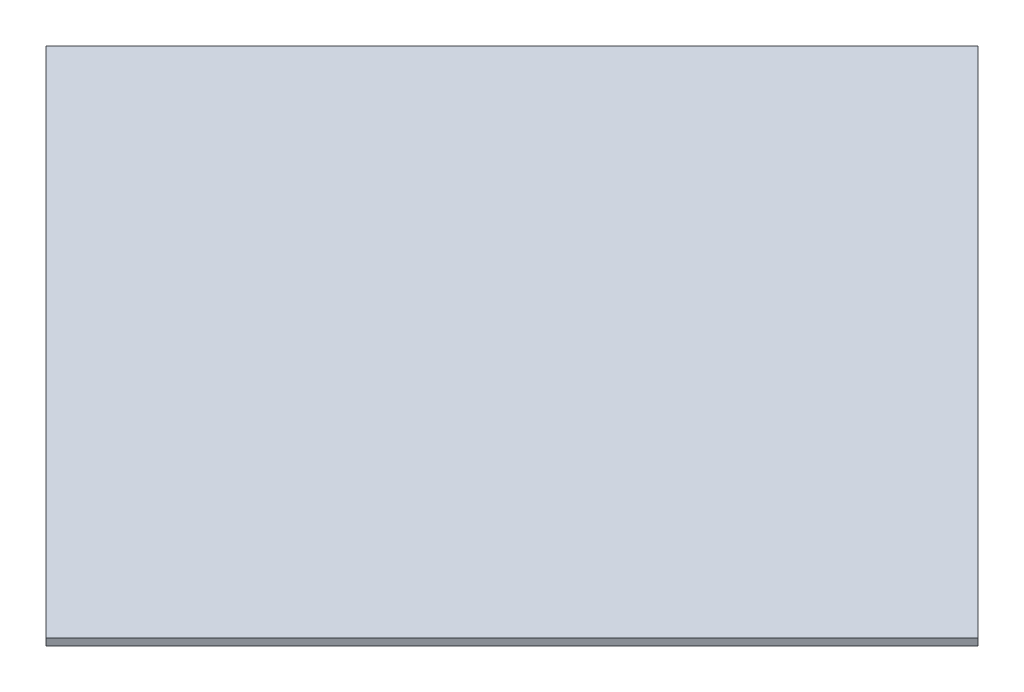
ISO-10303-21;
HEADER;
FILE_DESCRIPTION(('STEP AP214'),'2;1');
FILE_NAME('part.step','',(''),(''),'','','');
FILE_SCHEMA(('AUTOMOTIVE_DESIGN { 1 0 10303 214 1 1 1 1 }'));
ENDSEC;
DATA;
#1=APPLICATION_CONTEXT('core data for automotive mechanical design processes');
#2=APPLICATION_PROTOCOL_DEFINITION('international standard','automotive_design',2000,#1);
#3=PRODUCT_CONTEXT('',#1,'mechanical');
#4=PRODUCT('Part','Part','',(#3));
#5=PRODUCT_RELATED_PRODUCT_CATEGORY('part','',(#4));
#6=PRODUCT_DEFINITION_FORMATION('','',#4);
#7=PRODUCT_DEFINITION_CONTEXT('part definition',#1,'design');
#8=PRODUCT_DEFINITION('design','',#6,#7);
#9=PRODUCT_DEFINITION_SHAPE('','',#8);
#10=(LENGTH_UNIT() NAMED_UNIT(*) SI_UNIT(.MILLI.,.METRE.));
#11=(NAMED_UNIT(*) PLANE_ANGLE_UNIT() SI_UNIT($,.RADIAN.));
#12=(NAMED_UNIT(*) SI_UNIT($,.STERADIAN.) SOLID_ANGLE_UNIT());
#13=UNCERTAINTY_MEASURE_WITH_UNIT(LENGTH_MEASURE(1.E-05),#10,'distance_accuracy_value','');
#14=(GEOMETRIC_REPRESENTATION_CONTEXT(3) GLOBAL_UNCERTAINTY_ASSIGNED_CONTEXT((#13)) GLOBAL_UNIT_ASSIGNED_CONTEXT((#10,
#11,#12)) REPRESENTATION_CONTEXT('',''));
#15=CARTESIAN_POINT('',(0.,0.,0.));
#16=DIRECTION('',(0.,0.,1.));
#17=DIRECTION('',(1.,0.,0.));
#18=AXIS2_PLACEMENT_3D('',#15,#16,#17);
#19=CARTESIAN_POINT('',(-73.2842712474619,10.,0.));
#20=DIRECTION('',(0.707106781186548,0.,-0.707106781186547));
#21=DIRECTION('',(0.707106781186547,0.,0.707106781186548));
#22=AXIS2_PLACEMENT_3D('',#19,#20,#21);
#23=PLANE('',#22);
#24=DIRECTION('',(0.,1.,0.));
#25=VECTOR('',#24,1.);
#26=CARTESIAN_POINT('',(-80.3553390593274,10.,-7.07106781186547));
#27=LINE('',#26,#25);
#28=CARTESIAN_POINT('',(-80.3553390593274,10.,-7.07106781186547));
#29=VERTEX_POINT('',#28);
#30=CARTESIAN_POINT('',(-80.3553390593274,10.2,-7.07106781186547));
#31=VERTEX_POINT('',#30);
#32=EDGE_CURVE('E11',#29,#31,#27,.T.);
#33=ORIENTED_EDGE('',*,*,#32,.F.);
#34=DIRECTION('',(0.707106781186547,0.,0.707106781186548));
#35=VECTOR('',#34,1.);
#36=CARTESIAN_POINT('',(-73.2842712474619,10.,0.));
#37=LINE('',#36,#35);
#38=CARTESIAN_POINT('',(-64.7989898732233,10.,8.48528137423857));
#39=VERTEX_POINT('',#38);
#40=EDGE_CURVE('E88',#29,#39,#37,.T.);
#41=ORIENTED_EDGE('',*,*,#40,.T.);
#42=DIRECTION('',(0.,1.,0.));
#43=VECTOR('',#42,1.);
#44=CARTESIAN_POINT('',(-64.7989898732233,10.,8.48528137423857));
#45=LINE('',#44,#43);
#46=CARTESIAN_POINT('',(-64.7989898732233,10.2,8.48528137423857));
#47=VERTEX_POINT('',#46);
#48=EDGE_CURVE('E43',#39,#47,#45,.T.);
#49=ORIENTED_EDGE('',*,*,#48,.T.);
#50=DIRECTION('',(0.707106781186547,0.,0.707106781186548));
#51=VECTOR('',#50,1.);
#52=CARTESIAN_POINT('',(-73.2842712474619,10.2,0.));
#53=LINE('',#52,#51);
#54=EDGE_CURVE('E101',#31,#47,#53,.T.);
#55=ORIENTED_EDGE('',*,*,#54,.F.);
#56=EDGE_LOOP('',(#33,#41,#49,#55));
#57=FACE_BOUND('',#56,.T.);
#58=ADVANCED_FACE('F33',(#57),#23,.F.);
#59=CARTESIAN_POINT('',(-64.7989898732233,10.,8.48528137423857));
#60=DIRECTION('',(-0.70710678118655,0.,-0.707106781186545));
#61=DIRECTION('',(0.707106781186545,0.,-0.70710678118655));
#62=AXIS2_PLACEMENT_3D('',#59,#60,#61);
#63=PLANE('',#62);
#64=ORIENTED_EDGE('',*,*,#48,.F.);
#65=DIRECTION('',(0.707106781186545,0.,-0.70710678118655));
#66=VECTOR('',#65,1.);
#67=CARTESIAN_POINT('',(-64.7989898732233,10.,8.48528137423857));
#68=LINE('',#67,#66);
#69=CARTESIAN_POINT('',(-50.6568542494924,10.,-5.65685424949243));
#70=VERTEX_POINT('',#69);
#71=EDGE_CURVE('E95',#39,#70,#68,.T.);
#72=ORIENTED_EDGE('',*,*,#71,.T.);
#73=DIRECTION('',(0.,1.,0.));
#74=VECTOR('',#73,1.);
#75=CARTESIAN_POINT('',(-50.6568542494924,10.,-5.65685424949243));
#76=LINE('',#75,#74);
#77=CARTESIAN_POINT('',(-50.6568542494924,10.2,-5.65685424949243));
#78=VERTEX_POINT('',#77);
#79=EDGE_CURVE('E51',#70,#78,#76,.T.);
#80=ORIENTED_EDGE('',*,*,#79,.T.);
#81=DIRECTION('',(0.707106781186545,0.,-0.70710678118655));
#82=VECTOR('',#81,1.);
#83=CARTESIAN_POINT('',(-64.7989898732233,10.2,8.48528137423857));
#84=LINE('',#83,#82);
#85=EDGE_CURVE('E82',#47,#78,#84,.T.);
#86=ORIENTED_EDGE('',*,*,#85,.F.);
#87=EDGE_LOOP('',(#64,#72,#80,#86));
#88=FACE_BOUND('',#87,.T.);
#89=ADVANCED_FACE('F105',(#88),#63,.F.);
#90=CARTESIAN_POINT('',(-22.5,10.,22.5));
#91=DIRECTION('',(0.707106781186548,0.,-0.707106781186547));
#92=DIRECTION('',(0.707106781186547,0.,0.707106781186548));
#93=AXIS2_PLACEMENT_3D('',#90,#91,#92);
#94=PLANE('',#93);
#95=ORIENTED_EDGE('',*,*,#79,.F.);
#96=DIRECTION('',(0.707106781186547,0.,0.707106781186548));
#97=VECTOR('',#96,1.);
#98=CARTESIAN_POINT('',(-22.5,10.,22.5));
#99=LINE('',#98,#97);
#100=CARTESIAN_POINT('',(-66.2132034355964,10.,-21.2132034355964));
#101=VERTEX_POINT('',#100);
#102=EDGE_CURVE('E87',#101,#70,#99,.T.);
#103=ORIENTED_EDGE('',*,*,#102,.F.);
#104=DIRECTION('',(0.,1.,0.));
#105=VECTOR('',#104,1.);
#106=CARTESIAN_POINT('',(-66.2132034355964,10.,-21.2132034355964));
#107=LINE('',#106,#105);
#108=CARTESIAN_POINT('',(-66.2132034355964,10.2,-21.2132034355964));
#109=VERTEX_POINT('',#108);
#110=EDGE_CURVE('E37',#101,#109,#107,.T.);
#111=ORIENTED_EDGE('',*,*,#110,.T.);
#112=DIRECTION('',(0.707106781186547,0.,0.707106781186548));
#113=VECTOR('',#112,1.);
#114=CARTESIAN_POINT('',(-22.5,10.2,22.5));
#115=LINE('',#114,#113);
#116=EDGE_CURVE('E97',#109,#78,#115,.T.);
#117=ORIENTED_EDGE('',*,*,#116,.T.);
#118=EDGE_LOOP('',(#95,#103,#111,#117));
#119=FACE_BOUND('',#118,.T.);
#120=ADVANCED_FACE('F90',(#119),#94,.T.);
#121=CARTESIAN_POINT('',(-80.3553390593274,10.,-7.07106781186547));
#122=DIRECTION('',(0.707106781186548,0.,0.707106781186548));
#123=DIRECTION('',(-0.707106781186547,0.,0.707106781186547));
#124=AXIS2_PLACEMENT_3D('',#121,#122,#123);
#125=PLANE('',#124);
#126=DIRECTION('',(-0.707106781186547,0.,0.707106781186547));
#127=VECTOR('',#126,1.);
#128=CARTESIAN_POINT('',(-80.3553390593274,10.,-7.07106781186547));
#129=LINE('',#128,#127);
#130=EDGE_CURVE('E76',#101,#29,#129,.T.);
#131=ORIENTED_EDGE('',*,*,#130,.T.);
#132=ORIENTED_EDGE('',*,*,#32,.T.);
#133=DIRECTION('',(-0.707106781186547,0.,0.707106781186547));
#134=VECTOR('',#133,1.);
#135=CARTESIAN_POINT('',(-80.3553390593274,10.2,-7.07106781186547));
#136=LINE('',#135,#134);
#137=EDGE_CURVE('E78',#109,#31,#136,.T.);
#138=ORIENTED_EDGE('',*,*,#137,.F.);
#139=ORIENTED_EDGE('',*,*,#110,.F.);
#140=EDGE_LOOP('',(#131,#132,#138,#139));
#141=FACE_BOUND('',#140,.T.);
#142=ADVANCED_FACE('F35',(#141),#125,.F.);
#143=CARTESIAN_POINT('',(0.,10.2,0.));
#144=DIRECTION('',(0.,-1.,0.));
#145=DIRECTION('',(0.,0.,-1.));
#146=AXIS2_PLACEMENT_3D('',#143,#144,#145);
#147=PLANE('',#146);
#148=ORIENTED_EDGE('',*,*,#116,.F.);
#149=ORIENTED_EDGE('',*,*,#137,.T.);
#150=ORIENTED_EDGE('',*,*,#54,.T.);
#151=ORIENTED_EDGE('',*,*,#85,.T.);
#152=EDGE_LOOP('',(#148,#149,#150,#151));
#153=FACE_BOUND('',#152,.T.);
#154=ADVANCED_FACE('F104',(#153),#147,.F.);
#155=CARTESIAN_POINT('',(0.,10.,0.));
#156=DIRECTION('',(0.,-1.,0.));
#157=DIRECTION('',(0.,0.,-1.));
#158=AXIS2_PLACEMENT_3D('',#155,#156,#157);
#159=PLANE('',#158);
#160=ORIENTED_EDGE('',*,*,#102,.T.);
#161=ORIENTED_EDGE('',*,*,#71,.F.);
#162=ORIENTED_EDGE('',*,*,#40,.F.);
#163=ORIENTED_EDGE('',*,*,#130,.F.);
#164=EDGE_LOOP('',(#160,#161,#162,#163));
#165=FACE_BOUND('',#164,.T.);
#166=ADVANCED_FACE('F85',(#165),#159,.T.);
#167=CLOSED_SHELL('',(#58,#89,#120,#142,#154,#166));
#168=MANIFOLD_SOLID_BREP('B2',#167);
#169=ADVANCED_BREP_SHAPE_REPRESENTATION('',(#18,#168),#14);
#170=SHAPE_DEFINITION_REPRESENTATION(#9,#169);
ENDSEC;
END-ISO-10303-21;
